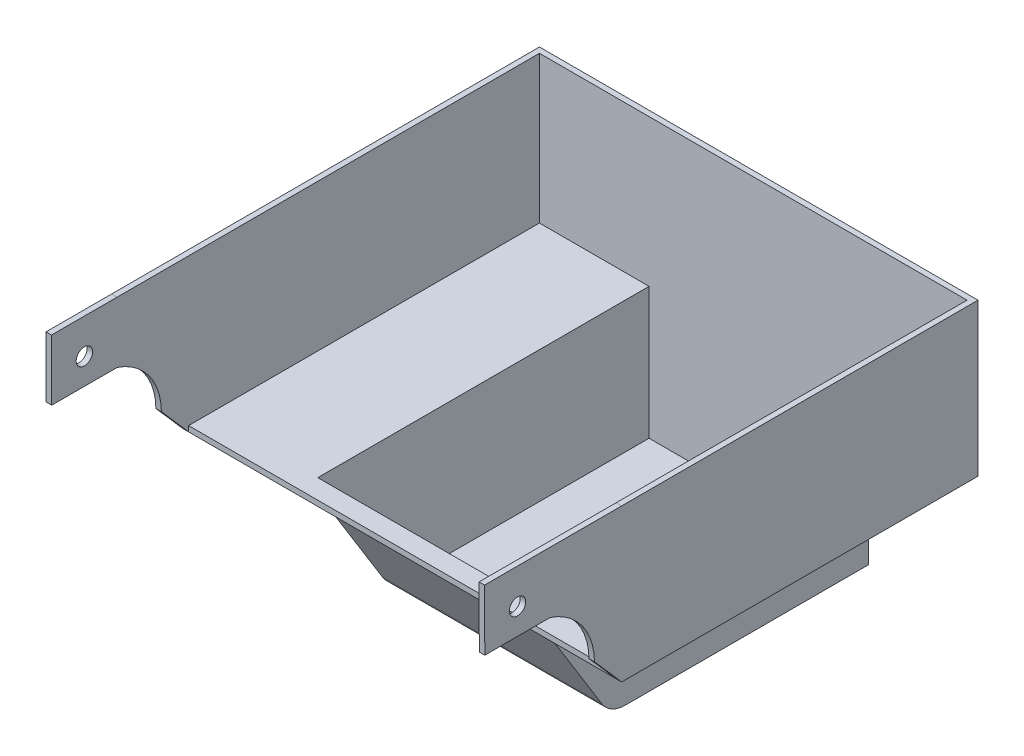
ISO-10303-21;
HEADER;
FILE_DESCRIPTION(('STEP AP214'),'2;1');
FILE_NAME('part.step','',(''),(''),'','','');
FILE_SCHEMA(('AUTOMOTIVE_DESIGN { 1 0 10303 214 1 1 1 1 }'));
ENDSEC;
DATA;
#1=APPLICATION_CONTEXT('core data for automotive mechanical design processes');
#2=APPLICATION_PROTOCOL_DEFINITION('international standard','automotive_design',2000,#1);
#3=PRODUCT_CONTEXT('',#1,'mechanical');
#4=PRODUCT('Part','Part','',(#3));
#5=PRODUCT_RELATED_PRODUCT_CATEGORY('part','',(#4));
#6=PRODUCT_DEFINITION_FORMATION('','',#4);
#7=PRODUCT_DEFINITION_CONTEXT('part definition',#1,'design');
#8=PRODUCT_DEFINITION('design','',#6,#7);
#9=PRODUCT_DEFINITION_SHAPE('','',#8);
#10=(LENGTH_UNIT() NAMED_UNIT(*) SI_UNIT(.MILLI.,.METRE.));
#11=(NAMED_UNIT(*) PLANE_ANGLE_UNIT() SI_UNIT($,.RADIAN.));
#12=(NAMED_UNIT(*) SI_UNIT($,.STERADIAN.) SOLID_ANGLE_UNIT());
#13=UNCERTAINTY_MEASURE_WITH_UNIT(LENGTH_MEASURE(1.E-05),#10,'distance_accuracy_value','');
#14=(GEOMETRIC_REPRESENTATION_CONTEXT(3) GLOBAL_UNCERTAINTY_ASSIGNED_CONTEXT((#13)) GLOBAL_UNIT_ASSIGNED_CONTEXT((#10,
#11,#12)) REPRESENTATION_CONTEXT('',''));
#15=CARTESIAN_POINT('',(0.,0.,0.));
#16=DIRECTION('',(0.,0.,1.));
#17=DIRECTION('',(1.,0.,0.));
#18=AXIS2_PLACEMENT_3D('',#15,#16,#17);
#19=CARTESIAN_POINT('',(0.,0.,130.));
#20=DIRECTION('',(0.,0.,-1.));
#21=DIRECTION('',(-1.,0.,0.));
#22=AXIS2_PLACEMENT_3D('',#19,#20,#21);
#23=PLANE('',#22);
#24=DIRECTION('',(0.,1.,0.));
#25=VECTOR('',#24,1.);
#26=CARTESIAN_POINT('',(78.,0.,130.));
#27=LINE('',#26,#25);
#28=CARTESIAN_POINT('',(78.,0.,130.));
#29=VERTEX_POINT('',#28);
#30=CARTESIAN_POINT('',(78.,2.,130.));
#31=VERTEX_POINT('',#30);
#32=EDGE_CURVE('E244',#29,#31,#27,.T.);
#33=ORIENTED_EDGE('',*,*,#32,.T.);
#34=DIRECTION('',(-1.,0.,0.));
#35=VECTOR('',#34,1.);
#36=CARTESIAN_POINT('',(0.,2.,130.));
#37=LINE('',#36,#35);
#38=CARTESIAN_POINT('',(-78.,2.,130.));
#39=VERTEX_POINT('',#38);
#40=EDGE_CURVE('E313',#31,#39,#37,.T.);
#41=ORIENTED_EDGE('',*,*,#40,.T.);
#42=DIRECTION('',(0.,-1.,0.));
#43=VECTOR('',#42,1.);
#44=CARTESIAN_POINT('',(-78.,0.,130.));
#45=LINE('',#44,#43);
#46=CARTESIAN_POINT('',(-78.,0.,130.));
#47=VERTEX_POINT('',#46);
#48=EDGE_CURVE('E44',#39,#47,#45,.T.);
#49=ORIENTED_EDGE('',*,*,#48,.T.);
#50=DIRECTION('',(1.,0.,0.));
#51=VECTOR('',#50,1.);
#52=CARTESIAN_POINT('',(-80.,0.,130.));
#53=LINE('',#52,#51);
#54=EDGE_CURVE('E388',#47,#29,#53,.T.);
#55=ORIENTED_EDGE('',*,*,#54,.T.);
#56=EDGE_LOOP('',(#33,#41,#49,#55));
#57=FACE_BOUND('',#56,.T.);
#58=ADVANCED_FACE('F35',(#57),#23,.F.);
#59=CARTESIAN_POINT('',(-80.,55.63,124.));
#60=DIRECTION('',(0.,-1.,0.));
#61=DIRECTION('',(0.,0.,-1.));
#62=AXIS2_PLACEMENT_3D('',#59,#60,#61);
#63=PLANE('',#62);
#64=DIRECTION('',(0.,0.,-1.));
#65=VECTOR('',#64,1.);
#66=CARTESIAN_POINT('',(-80.,55.63,124.));
#67=LINE('',#66,#65);
#68=CARTESIAN_POINT('',(-80.,55.63,156.092113107262));
#69=VERTEX_POINT('',#68);
#70=CARTESIAN_POINT('',(-80.,55.63,0.));
#71=VERTEX_POINT('',#70);
#72=EDGE_CURVE('E430',#69,#71,#67,.T.);
#73=ORIENTED_EDGE('',*,*,#72,.F.);
#74=DIRECTION('',(-1.,0.,0.));
#75=VECTOR('',#74,1.);
#76=CARTESIAN_POINT('',(-78.,55.63,156.092113107262));
#77=LINE('',#76,#75);
#78=CARTESIAN_POINT('',(-78.,55.63,156.092113107262));
#79=VERTEX_POINT('',#78);
#80=EDGE_CURVE('E308',#79,#69,#77,.T.);
#81=ORIENTED_EDGE('',*,*,#80,.F.);
#82=DIRECTION('',(0.,0.,-1.));
#83=VECTOR('',#82,1.);
#84=CARTESIAN_POINT('',(-78.,55.63,124.));
#85=LINE('',#84,#83);
#86=CARTESIAN_POINT('',(-78.,55.63,2.));
#87=VERTEX_POINT('',#86);
#88=EDGE_CURVE('E357',#79,#87,#85,.T.);
#89=ORIENTED_EDGE('',*,*,#88,.T.);
#90=DIRECTION('',(-1.,0.,0.));
#91=VECTOR('',#90,1.);
#92=CARTESIAN_POINT('',(0.,55.63,2.));
#93=LINE('',#92,#91);
#94=CARTESIAN_POINT('',(78.,55.63,2.));
#95=VERTEX_POINT('',#94);
#96=EDGE_CURVE('E361',#95,#87,#93,.T.);
#97=ORIENTED_EDGE('',*,*,#96,.F.);
#98=DIRECTION('',(0.,0.,-1.));
#99=VECTOR('',#98,1.);
#100=CARTESIAN_POINT('',(78.,55.63,124.));
#101=LINE('',#100,#99);
#102=CARTESIAN_POINT('',(78.,55.63,130.));
#103=VERTEX_POINT('',#102);
#104=EDGE_CURVE('E355',#103,#95,#101,.T.);
#105=ORIENTED_EDGE('',*,*,#104,.F.);
#106=DIRECTION('',(-1.,0.,0.));
#107=VECTOR('',#106,1.);
#108=CARTESIAN_POINT('',(-80.,55.63,130.));
#109=LINE('',#108,#107);
#110=CARTESIAN_POINT('',(80.,55.63,130.));
#111=VERTEX_POINT('',#110);
#112=EDGE_CURVE('E243',#111,#103,#109,.T.);
#113=ORIENTED_EDGE('',*,*,#112,.F.);
#114=DIRECTION('',(0.,0.,-1.));
#115=VECTOR('',#114,1.);
#116=CARTESIAN_POINT('',(80.,55.63,124.));
#117=LINE('',#116,#115);
#118=CARTESIAN_POINT('',(80.,55.63,0.));
#119=VERTEX_POINT('',#118);
#120=EDGE_CURVE('E433',#111,#119,#117,.T.);
#121=ORIENTED_EDGE('',*,*,#120,.T.);
#122=DIRECTION('',(-1.,0.,0.));
#123=VECTOR('',#122,1.);
#124=CARTESIAN_POINT('',(-80.,55.63,0.));
#125=LINE('',#124,#123);
#126=EDGE_CURVE('E403',#119,#71,#125,.T.);
#127=ORIENTED_EDGE('',*,*,#126,.T.);
#128=EDGE_LOOP('',(#73,#81,#89,#97,#105,#113,#121,#127));
#129=FACE_BOUND('',#128,.T.);
#130=ADVANCED_FACE('F474',(#129),#63,.F.);
#131=CARTESIAN_POINT('',(-40.,-48.,124.));
#132=DIRECTION('',(0.,1.,0.));
#133=DIRECTION('',(-1.,0.,0.));
#134=AXIS2_PLACEMENT_3D('',#131,#132,#133);
#135=PLANE('',#134);
#136=DIRECTION('',(-1.,0.,0.));
#137=VECTOR('',#136,1.);
#138=CARTESIAN_POINT('',(80.,-48.,88.7507921419018));
#139=LINE('',#138,#137);
#140=CARTESIAN_POINT('',(40.,-48.,88.7507921419018));
#141=VERTEX_POINT('',#140);
#142=CARTESIAN_POINT('',(-40.,-48.,88.7507921419018));
#143=VERTEX_POINT('',#142);
#144=EDGE_CURVE('E377',#141,#143,#139,.T.);
#145=ORIENTED_EDGE('',*,*,#144,.T.);
#146=DIRECTION('',(0.,0.,-1.));
#147=VECTOR('',#146,1.);
#148=CARTESIAN_POINT('',(-40.,-48.,124.));
#149=LINE('',#148,#147);
#150=CARTESIAN_POINT('',(-40.,-48.,0.));
#151=VERTEX_POINT('',#150);
#152=EDGE_CURVE('E423',#143,#151,#149,.T.);
#153=ORIENTED_EDGE('',*,*,#152,.T.);
#154=DIRECTION('',(1.,0.,0.));
#155=VECTOR('',#154,1.);
#156=CARTESIAN_POINT('',(-40.,-48.,0.));
#157=LINE('',#156,#155);
#158=CARTESIAN_POINT('',(40.,-48.,0.));
#159=VERTEX_POINT('',#158);
#160=EDGE_CURVE('E413',#151,#159,#157,.T.);
#161=ORIENTED_EDGE('',*,*,#160,.T.);
#162=DIRECTION('',(0.,0.,-1.));
#163=VECTOR('',#162,1.);
#164=CARTESIAN_POINT('',(40.,-48.,124.));
#165=LINE('',#164,#163);
#166=EDGE_CURVE('E421',#141,#159,#165,.T.);
#167=ORIENTED_EDGE('',*,*,#166,.F.);
#168=EDGE_LOOP('',(#145,#153,#161,#167));
#169=FACE_BOUND('',#168,.T.);
#170=ADVANCED_FACE('F447',(#169),#135,.F.);
#171=CARTESIAN_POINT('',(80.,55.63,124.));
#172=DIRECTION('',(-1.,0.,0.));
#173=DIRECTION('',(0.,0.,1.));
#174=AXIS2_PLACEMENT_3D('',#171,#172,#173);
#175=PLANE('',#174);
#176=CARTESIAN_POINT('',(80.,42.8788561148023,168.015437142677));
#177=DIRECTION('',(1.,0.,0.));
#178=DIRECTION('',(0.,0.,-1.));
#179=AXIS2_PLACEMENT_3D('',#176,#177,#178);
#180=CIRCLE('',#179,2.99999999999999);
#181=CARTESIAN_POINT('',(80.,42.8788561148023,165.015437142677));
#182=VERTEX_POINT('',#181);
#183=EDGE_CURVE('E620',#182,#182,#180,.T.);
#184=ORIENTED_EDGE('',*,*,#183,.F.);
#185=EDGE_LOOP('',(#184));
#186=FACE_BOUND('',#185,.T.);
#187=DIRECTION('',(0.,1.,0.));
#188=VECTOR('',#187,1.);
#189=CARTESIAN_POINT('',(80.,55.63,0.));
#190=LINE('',#189,#188);
#191=CARTESIAN_POINT('',(80.,0.,0.));
#192=VERTEX_POINT('',#191);
#193=EDGE_CURVE('E401',#192,#119,#190,.T.);
#194=ORIENTED_EDGE('',*,*,#193,.T.);
#195=ORIENTED_EDGE('',*,*,#120,.F.);
#196=DIRECTION('',(0.,-5.22082282492771E-06,0.999999999986371));
#197=VECTOR('',#196,1.);
#198=CARTESIAN_POINT('',(80.,55.63,130.));
#199=LINE('',#198,#197);
#200=CARTESIAN_POINT('',(80.,55.6297388202511,180.026549010974));
#201=VERTEX_POINT('',#200);
#202=EDGE_CURVE('E257',#111,#201,#199,.T.);
#203=ORIENTED_EDGE('',*,*,#202,.T.);
#204=DIRECTION('',(0.,-0.99999219743184,-0.00395032599163589));
#205=VECTOR('',#204,1.);
#206=CARTESIAN_POINT('',(80.,55.6297388202511,180.026549010974));
#207=LINE('',#206,#205);
#208=CARTESIAN_POINT('',(80.,33.4069784459925,179.938761178091));
#209=VERTEX_POINT('',#208);
#210=EDGE_CURVE('E221',#201,#209,#207,.T.);
#211=ORIENTED_EDGE('',*,*,#210,.T.);
#212=DIRECTION('',(0.,0.,-1.));
#213=VECTOR('',#212,1.);
#214=CARTESIAN_POINT('',(80.,33.4069784459925,179.938761178091));
#215=LINE('',#214,#213);
#216=CARTESIAN_POINT('',(80.,33.4069784459925,156.092113107262));
#217=VERTEX_POINT('',#216);
#218=EDGE_CURVE('E261',#209,#217,#215,.T.);
#219=ORIENTED_EDGE('',*,*,#218,.T.);
#220=CARTESIAN_POINT('',(80.,11.1500000505858,163.334420687461));
#221=DIRECTION('',(-1.,0.,0.));
#222=DIRECTION('',(0.,0.,-1.));
#223=AXIS2_PLACEMENT_3D('',#220,#221,#222);
#224=CIRCLE('',#223,23.4056426183901);
#225=CARTESIAN_POINT('',(80.,11.3483376382493,139.929618432772));
#226=VERTEX_POINT('',#225);
#227=EDGE_CURVE('E264',#217,#226,#224,.T.);
#228=ORIENTED_EDGE('',*,*,#227,.T.);
#229=DIRECTION('',(0.,-0.752582511776215,-0.658497959730023));
#230=VECTOR('',#229,1.);
#231=CARTESIAN_POINT('',(80.,11.3483376382493,139.929618432772));
#232=LINE('',#231,#230);
#233=CARTESIAN_POINT('',(80.,0.,130.));
#234=VERTEX_POINT('',#233);
#235=EDGE_CURVE('E247',#226,#234,#232,.T.);
#236=ORIENTED_EDGE('',*,*,#235,.T.);
#237=DIRECTION('',(0.,0.,-1.));
#238=VECTOR('',#237,1.);
#239=CARTESIAN_POINT('',(80.,0.,124.));
#240=LINE('',#239,#238);
#241=EDGE_CURVE('E398',#234,#192,#240,.T.);
#242=ORIENTED_EDGE('',*,*,#241,.T.);
#243=EDGE_LOOP('',(#194,#195,#203,#211,#219,#228,#236,#242));
#244=FACE_BOUND('',#243,.T.);
#245=ADVANCED_FACE('F37',(#186,#244),#175,.F.);
#246=CARTESIAN_POINT('',(-80.,0.,124.));
#247=DIRECTION('',(1.,0.,0.));
#248=DIRECTION('',(0.,0.,-1.));
#249=AXIS2_PLACEMENT_3D('',#246,#247,#248);
#250=PLANE('',#249);
#251=CARTESIAN_POINT('',(-80.,42.8788561148023,168.015437142677));
#252=DIRECTION('',(1.,0.,0.));
#253=DIRECTION('',(0.,0.,-1.));
#254=AXIS2_PLACEMENT_3D('',#251,#252,#253);
#255=CIRCLE('',#254,2.99999999999999);
#256=CARTESIAN_POINT('',(-80.,42.8788561148023,165.015437142677));
#257=VERTEX_POINT('',#256);
#258=EDGE_CURVE('E503',#257,#257,#255,.T.);
#259=ORIENTED_EDGE('',*,*,#258,.T.);
#260=EDGE_LOOP('',(#259));
#261=FACE_BOUND('',#260,.T.);
#262=DIRECTION('',(0.,0.752582511776214,0.658497959730025));
#263=VECTOR('',#262,1.);
#264=CARTESIAN_POINT('',(-80.,29.82008938625,156.092113107262));
#265=LINE('',#264,#263);
#266=CARTESIAN_POINT('',(-80.,0.,130.));
#267=VERTEX_POINT('',#266);
#268=CARTESIAN_POINT('',(-80.,11.3483376382493,139.929618432772));
#269=VERTEX_POINT('',#268);
#270=EDGE_CURVE('E301',#267,#269,#265,.T.);
#271=ORIENTED_EDGE('',*,*,#270,.T.);
#272=CARTESIAN_POINT('',(-80.,11.1500000505858,163.334420687461));
#273=DIRECTION('',(-1.,0.,0.));
#274=DIRECTION('',(0.,0.,1.));
#275=AXIS2_PLACEMENT_3D('',#272,#273,#274);
#276=CIRCLE('',#275,23.4056426183901);
#277=CARTESIAN_POINT('',(-80.,33.4069784459925,156.092113107262));
#278=VERTEX_POINT('',#277);
#279=EDGE_CURVE('E58',#278,#269,#276,.T.);
#280=ORIENTED_EDGE('',*,*,#279,.F.);
#281=DIRECTION('',(0.,0.,1.));
#282=VECTOR('',#281,1.);
#283=CARTESIAN_POINT('',(-80.,33.4069784459925,156.092113107262));
#284=LINE('',#283,#282);
#285=CARTESIAN_POINT('',(-80.,33.4069784459925,179.938761178091));
#286=VERTEX_POINT('',#285);
#287=EDGE_CURVE('E270',#278,#286,#284,.T.);
#288=ORIENTED_EDGE('',*,*,#287,.T.);
#289=DIRECTION('',(0.,0.99999219743184,0.00395032599163589));
#290=VECTOR('',#289,1.);
#291=CARTESIAN_POINT('',(-80.,33.4069784459925,179.938761178091));
#292=LINE('',#291,#290);
#293=CARTESIAN_POINT('',(-80.,55.6297388202511,180.026549010974));
#294=VERTEX_POINT('',#293);
#295=EDGE_CURVE('E288',#286,#294,#292,.T.);
#296=ORIENTED_EDGE('',*,*,#295,.T.);
#297=DIRECTION('',(0.,1.09123001673236E-05,-0.999999999940461));
#298=VECTOR('',#297,1.);
#299=CARTESIAN_POINT('',(-80.,55.6297388202511,180.026549010974));
#300=LINE('',#299,#298);
#301=EDGE_CURVE('E280',#294,#69,#300,.T.);
#302=ORIENTED_EDGE('',*,*,#301,.T.);
#303=ORIENTED_EDGE('',*,*,#72,.T.);
#304=DIRECTION('',(0.,-1.,0.));
#305=VECTOR('',#304,1.);
#306=CARTESIAN_POINT('',(-80.,0.,0.));
#307=LINE('',#306,#305);
#308=CARTESIAN_POINT('',(-80.,0.,0.));
#309=VERTEX_POINT('',#308);
#310=EDGE_CURVE('E405',#71,#309,#307,.T.);
#311=ORIENTED_EDGE('',*,*,#310,.T.);
#312=DIRECTION('',(0.,0.,-1.));
#313=VECTOR('',#312,1.);
#314=CARTESIAN_POINT('',(-80.,0.,124.));
#315=LINE('',#314,#313);
#316=EDGE_CURVE('E428',#267,#309,#315,.T.);
#317=ORIENTED_EDGE('',*,*,#316,.F.);
#318=EDGE_LOOP('',(#271,#280,#288,#296,#302,#303,#311,#317));
#319=FACE_BOUND('',#318,.T.);
#320=ADVANCED_FACE('F492',(#261,#319),#250,.F.);
#321=CARTESIAN_POINT('',(-80.,0.,124.));
#322=DIRECTION('',(0.,1.,0.));
#323=DIRECTION('',(0.,0.,1.));
#324=AXIS2_PLACEMENT_3D('',#321,#322,#323);
#325=PLANE('',#324);
#326=DIRECTION('',(0.,0.,-1.));
#327=VECTOR('',#326,1.);
#328=CARTESIAN_POINT('',(-40.,0.,124.));
#329=LINE('',#328,#327);
#330=CARTESIAN_POINT('',(-40.,0.,124.));
#331=VERTEX_POINT('',#330);
#332=CARTESIAN_POINT('',(-40.,0.,0.));
#333=VERTEX_POINT('',#332);
#334=EDGE_CURVE('E425',#331,#333,#329,.T.);
#335=ORIENTED_EDGE('',*,*,#334,.F.);
#336=DIRECTION('',(1.,0.,0.));
#337=VECTOR('',#336,1.);
#338=CARTESIAN_POINT('',(-80.,0.,124.));
#339=LINE('',#338,#337);
#340=CARTESIAN_POINT('',(40.,0.,124.));
#341=VERTEX_POINT('',#340);
#342=EDGE_CURVE('E394',#331,#341,#339,.T.);
#343=ORIENTED_EDGE('',*,*,#342,.T.);
#344=DIRECTION('',(0.,0.,-1.));
#345=VECTOR('',#344,1.);
#346=CARTESIAN_POINT('',(40.,0.,124.));
#347=LINE('',#346,#345);
#348=CARTESIAN_POINT('',(40.,0.,0.));
#349=VERTEX_POINT('',#348);
#350=EDGE_CURVE('E418',#341,#349,#347,.T.);
#351=ORIENTED_EDGE('',*,*,#350,.T.);
#352=DIRECTION('',(1.,0.,0.));
#353=VECTOR('',#352,1.);
#354=CARTESIAN_POINT('',(40.,0.,0.));
#355=LINE('',#354,#353);
#356=EDGE_CURVE('E393',#349,#192,#355,.T.);
#357=ORIENTED_EDGE('',*,*,#356,.T.);
#358=ORIENTED_EDGE('',*,*,#241,.F.);
#359=DIRECTION('',(1.,0.,0.));
#360=VECTOR('',#359,1.);
#361=CARTESIAN_POINT('',(78.,0.,130.));
#362=LINE('',#361,#360);
#363=EDGE_CURVE('E51',#29,#234,#362,.T.);
#364=ORIENTED_EDGE('',*,*,#363,.F.);
#365=ORIENTED_EDGE('',*,*,#54,.F.);
#366=EDGE_CURVE('E389',#267,#47,#53,.T.);
#367=ORIENTED_EDGE('',*,*,#366,.F.);
#368=ORIENTED_EDGE('',*,*,#316,.T.);
#369=DIRECTION('',(1.,0.,0.));
#370=VECTOR('',#369,1.);
#371=CARTESIAN_POINT('',(-80.,0.,0.));
#372=LINE('',#371,#370);
#373=EDGE_CURVE('E408',#309,#333,#372,.T.);
#374=ORIENTED_EDGE('',*,*,#373,.T.);
#375=EDGE_LOOP('',(#335,#343,#351,#357,#358,#364,#365,#367,#368,#374));
#376=FACE_BOUND('',#375,.T.);
#377=ADVANCED_FACE('F457',(#376),#325,.F.);
#378=CARTESIAN_POINT('',(-40.,-48.,124.));
#379=DIRECTION('',(1.,0.,0.));
#380=DIRECTION('',(0.,0.,-1.));
#381=AXIS2_PLACEMENT_3D('',#378,#379,#380);
#382=PLANE('',#381);
#383=ORIENTED_EDGE('',*,*,#152,.F.);
#384=CARTESIAN_POINT('',(-40.,-38.,88.7507921419018));
#385=DIRECTION('',(1.,0.,0.));
#386=DIRECTION('',(0.,0.,-1.));
#387=AXIS2_PLACEMENT_3D('',#384,#385,#386);
#388=CIRCLE('',#387,10.);
#389=CARTESIAN_POINT('',(-40.,-43.2584793879041,97.25657808601));
#390=VERTEX_POINT('',#389);
#391=EDGE_CURVE('E385',#143,#390,#388,.F.);
#392=ORIENTED_EDGE('',*,*,#391,.T.);
#393=DIRECTION('',(0.,0.850578594410813,0.525847938790413));
#394=VECTOR('',#393,1.);
#395=CARTESIAN_POINT('',(-40.,-34.727229372954,102.530799968792));
#396=LINE('',#395,#394);
#397=EDGE_CURVE('E380',#390,#331,#396,.T.);
#398=ORIENTED_EDGE('',*,*,#397,.T.);
#399=ORIENTED_EDGE('',*,*,#334,.T.);
#400=DIRECTION('',(0.,-1.,0.));
#401=VECTOR('',#400,1.);
#402=CARTESIAN_POINT('',(-40.,-48.,0.));
#403=LINE('',#402,#401);
#404=EDGE_CURVE('E410',#333,#151,#403,.T.);
#405=ORIENTED_EDGE('',*,*,#404,.T.);
#406=EDGE_LOOP('',(#383,#392,#398,#399,#405));
#407=FACE_BOUND('',#406,.T.);
#408=ADVANCED_FACE('F461',(#407),#382,.F.);
#409=CARTESIAN_POINT('',(40.,0.,124.));
#410=DIRECTION('',(-1.,0.,0.));
#411=DIRECTION('',(0.,-1.,0.));
#412=AXIS2_PLACEMENT_3D('',#409,#410,#411);
#413=PLANE('',#412);
#414=DIRECTION('',(0.,-0.850578594410813,-0.525847938790413));
#415=VECTOR('',#414,1.);
#416=CARTESIAN_POINT('',(40.,0.,124.));
#417=LINE('',#416,#415);
#418=CARTESIAN_POINT('',(40.,-43.2584793879041,97.25657808601));
#419=VERTEX_POINT('',#418);
#420=EDGE_CURVE('E397',#341,#419,#417,.T.);
#421=ORIENTED_EDGE('',*,*,#420,.T.);
#422=CARTESIAN_POINT('',(40.,-38.,88.7507921419018));
#423=DIRECTION('',(-1.,0.,0.));
#424=DIRECTION('',(0.,-1.,0.));
#425=AXIS2_PLACEMENT_3D('',#422,#423,#424);
#426=CIRCLE('',#425,10.);
#427=EDGE_CURVE('E304',#419,#141,#426,.F.);
#428=ORIENTED_EDGE('',*,*,#427,.T.);
#429=ORIENTED_EDGE('',*,*,#166,.T.);
#430=DIRECTION('',(0.,1.,0.));
#431=VECTOR('',#430,1.);
#432=CARTESIAN_POINT('',(40.,0.,0.));
#433=LINE('',#432,#431);
#434=EDGE_CURVE('E416',#159,#349,#433,.T.);
#435=ORIENTED_EDGE('',*,*,#434,.T.);
#436=ORIENTED_EDGE('',*,*,#350,.F.);
#437=EDGE_LOOP('',(#421,#428,#429,#435,#436));
#438=FACE_BOUND('',#437,.T.);
#439=ADVANCED_FACE('F443',(#438),#413,.F.);
#440=CARTESIAN_POINT('',(0.,0.,0.));
#441=DIRECTION('',(0.,0.,-1.));
#442=DIRECTION('',(-1.,0.,0.));
#443=AXIS2_PLACEMENT_3D('',#440,#441,#442);
#444=PLANE('',#443);
#445=ORIENTED_EDGE('',*,*,#356,.F.);
#446=ORIENTED_EDGE('',*,*,#434,.F.);
#447=ORIENTED_EDGE('',*,*,#160,.F.);
#448=ORIENTED_EDGE('',*,*,#404,.F.);
#449=ORIENTED_EDGE('',*,*,#373,.F.);
#450=ORIENTED_EDGE('',*,*,#310,.F.);
#451=ORIENTED_EDGE('',*,*,#126,.F.);
#452=ORIENTED_EDGE('',*,*,#193,.F.);
#453=EDGE_LOOP('',(#445,#446,#447,#448,#449,#450,#451,#452));
#454=FACE_BOUND('',#453,.T.);
#455=ADVANCED_FACE('F454',(#454),#444,.T.);
#456=CARTESIAN_POINT('',(80.,-38.,88.7507921419018));
#457=DIRECTION('',(-1.,0.,0.));
#458=DIRECTION('',(0.,0.,1.));
#459=AXIS2_PLACEMENT_3D('',#456,#457,#458);
#460=CYLINDRICAL_SURFACE('',#459,10.);
#461=ORIENTED_EDGE('',*,*,#144,.F.);
#462=ORIENTED_EDGE('',*,*,#427,.F.);
#463=DIRECTION('',(-1.,0.,0.));
#464=VECTOR('',#463,1.);
#465=CARTESIAN_POINT('',(80.,-43.2584793879041,97.25657808601));
#466=LINE('',#465,#464);
#467=EDGE_CURVE('E370',#419,#390,#466,.T.);
#468=ORIENTED_EDGE('',*,*,#467,.T.);
#469=ORIENTED_EDGE('',*,*,#391,.F.);
#470=EDGE_LOOP('',(#461,#462,#468,#469));
#471=FACE_BOUND('',#470,.T.);
#472=ADVANCED_FACE('F462',(#471),#460,.T.);
#473=CARTESIAN_POINT('',(80.,0.,124.));
#474=DIRECTION('',(0.,0.525847938790413,-0.850578594410813));
#475=DIRECTION('',(0.,0.850578594410813,0.525847938790413));
#476=AXIS2_PLACEMENT_3D('',#473,#474,#475);
#477=PLANE('',#476);
#478=ORIENTED_EDGE('',*,*,#467,.F.);
#479=ORIENTED_EDGE('',*,*,#420,.F.);
#480=ORIENTED_EDGE('',*,*,#342,.F.);
#481=ORIENTED_EDGE('',*,*,#397,.F.);
#482=EDGE_LOOP('',(#478,#479,#480,#481));
#483=FACE_BOUND('',#482,.T.);
#484=ADVANCED_FACE('F459',(#483),#477,.F.);
#485=CARTESIAN_POINT('',(-40.,-46.,124.));
#486=DIRECTION('',(0.,1.,0.));
#487=DIRECTION('',(-1.,0.,0.));
#488=AXIS2_PLACEMENT_3D('',#485,#486,#487);
#489=PLANE('',#488);
#490=DIRECTION('',(-1.,0.,0.));
#491=VECTOR('',#490,1.);
#492=CARTESIAN_POINT('',(-40.,-46.,88.7507921419018));
#493=LINE('',#492,#491);
#494=CARTESIAN_POINT('',(38.,-46.,88.7507921419018));
#495=VERTEX_POINT('',#494);
#496=CARTESIAN_POINT('',(-38.,-46.,88.7507921419018));
#497=VERTEX_POINT('',#496);
#498=EDGE_CURVE('E317',#495,#497,#493,.T.);
#499=ORIENTED_EDGE('',*,*,#498,.F.);
#500=DIRECTION('',(0.,0.,-1.));
#501=VECTOR('',#500,1.);
#502=CARTESIAN_POINT('',(38.,-46.,124.));
#503=LINE('',#502,#501);
#504=CARTESIAN_POINT('',(38.,-46.,2.));
#505=VERTEX_POINT('',#504);
#506=EDGE_CURVE('E324',#495,#505,#503,.T.);
#507=ORIENTED_EDGE('',*,*,#506,.T.);
#508=DIRECTION('',(1.,0.,0.));
#509=VECTOR('',#508,1.);
#510=CARTESIAN_POINT('',(0.,-46.,2.));
#511=LINE('',#510,#509);
#512=CARTESIAN_POINT('',(-38.,-46.,2.));
#513=VERTEX_POINT('',#512);
#514=EDGE_CURVE('E325',#513,#505,#511,.T.);
#515=ORIENTED_EDGE('',*,*,#514,.F.);
#516=DIRECTION('',(0.,0.,-1.));
#517=VECTOR('',#516,1.);
#518=CARTESIAN_POINT('',(-38.,-46.,124.));
#519=LINE('',#518,#517);
#520=EDGE_CURVE('E321',#497,#513,#519,.T.);
#521=ORIENTED_EDGE('',*,*,#520,.F.);
#522=EDGE_LOOP('',(#499,#507,#515,#521));
#523=FACE_BOUND('',#522,.T.);
#524=ADVANCED_FACE('F469',(#523),#489,.T.);
#525=CARTESIAN_POINT('',(78.,55.63,124.));
#526=DIRECTION('',(-1.,0.,0.));
#527=DIRECTION('',(0.,0.,1.));
#528=AXIS2_PLACEMENT_3D('',#525,#526,#527);
#529=PLANE('',#528);
#530=CARTESIAN_POINT('',(78.,42.8788561148023,168.015437142677));
#531=DIRECTION('',(-1.,0.,0.));
#532=DIRECTION('',(0.,0.,1.));
#533=AXIS2_PLACEMENT_3D('',#530,#531,#532);
#534=CIRCLE('',#533,2.99999999999999);
#535=CARTESIAN_POINT('',(78.,42.8788561148023,171.015437142677));
#536=VERTEX_POINT('',#535);
#537=EDGE_CURVE('E259',#536,#536,#534,.T.);
#538=ORIENTED_EDGE('',*,*,#537,.F.);
#539=EDGE_LOOP('',(#538));
#540=FACE_BOUND('',#539,.T.);
#541=DIRECTION('',(0.,1.,0.));
#542=VECTOR('',#541,1.);
#543=CARTESIAN_POINT('',(78.,0.,2.));
#544=LINE('',#543,#542);
#545=CARTESIAN_POINT('',(78.,2.,2.));
#546=VERTEX_POINT('',#545);
#547=EDGE_CURVE('E353',#546,#95,#544,.T.);
#548=ORIENTED_EDGE('',*,*,#547,.F.);
#549=DIRECTION('',(0.,0.,-1.));
#550=VECTOR('',#549,1.);
#551=CARTESIAN_POINT('',(78.,2.,124.));
#552=LINE('',#551,#550);
#553=EDGE_CURVE('E348',#31,#546,#552,.T.);
#554=ORIENTED_EDGE('',*,*,#553,.F.);
#555=ORIENTED_EDGE('',*,*,#32,.F.);
#556=DIRECTION('',(0.,-0.752582511776215,-0.658497959730023));
#557=VECTOR('',#556,1.);
#558=CARTESIAN_POINT('',(78.,11.3483376382493,139.929618432772));
#559=LINE('',#558,#557);
#560=CARTESIAN_POINT('',(78.,11.3483376382493,139.929618432772));
#561=VERTEX_POINT('',#560);
#562=EDGE_CURVE('E227',#561,#29,#559,.T.);
#563=ORIENTED_EDGE('',*,*,#562,.F.);
#564=CARTESIAN_POINT('',(78.,11.1500000505858,163.334420687461));
#565=DIRECTION('',(-1.,0.,0.));
#566=DIRECTION('',(0.,0.,-1.));
#567=AXIS2_PLACEMENT_3D('',#564,#565,#566);
#568=CIRCLE('',#567,23.4056426183901);
#569=CARTESIAN_POINT('',(78.,33.4069784459925,156.092113107262));
#570=VERTEX_POINT('',#569);
#571=EDGE_CURVE('E252',#570,#561,#568,.T.);
#572=ORIENTED_EDGE('',*,*,#571,.F.);
#573=DIRECTION('',(0.,0.,-1.));
#574=VECTOR('',#573,1.);
#575=CARTESIAN_POINT('',(78.,33.4069784459925,179.938761178091));
#576=LINE('',#575,#574);
#577=CARTESIAN_POINT('',(78.,33.4069784459925,179.938761178091));
#578=VERTEX_POINT('',#577);
#579=EDGE_CURVE('E238',#578,#570,#576,.T.);
#580=ORIENTED_EDGE('',*,*,#579,.F.);
#581=DIRECTION('',(0.,-0.99999219743184,-0.00395032599163589));
#582=VECTOR('',#581,1.);
#583=CARTESIAN_POINT('',(78.,55.6297388202511,180.026549010974));
#584=LINE('',#583,#582);
#585=CARTESIAN_POINT('',(78.,55.6297388202511,180.026549010974));
#586=VERTEX_POINT('',#585);
#587=EDGE_CURVE('E219',#586,#578,#584,.T.);
#588=ORIENTED_EDGE('',*,*,#587,.F.);
#589=DIRECTION('',(0.,-5.22082282492771E-06,0.999999999986371));
#590=VECTOR('',#589,1.);
#591=CARTESIAN_POINT('',(78.,55.63,130.));
#592=LINE('',#591,#590);
#593=EDGE_CURVE('E235',#103,#586,#592,.T.);
#594=ORIENTED_EDGE('',*,*,#593,.F.);
#595=ORIENTED_EDGE('',*,*,#104,.T.);
#596=EDGE_LOOP('',(#548,#554,#555,#563,#572,#580,#588,#594,#595));
#597=FACE_BOUND('',#596,.T.);
#598=ADVANCED_FACE('F233',(#540,#597),#529,.T.);
#599=CARTESIAN_POINT('',(-78.,0.,124.));
#600=DIRECTION('',(1.,0.,0.));
#601=DIRECTION('',(0.,0.,-1.));
#602=AXIS2_PLACEMENT_3D('',#599,#600,#601);
#603=PLANE('',#602);
#604=CARTESIAN_POINT('',(-78.,42.8788561148023,168.015437142677));
#605=DIRECTION('',(1.,0.,0.));
#606=DIRECTION('',(0.,0.,-1.));
#607=AXIS2_PLACEMENT_3D('',#604,#605,#606);
#608=CIRCLE('',#607,2.99999999999999);
#609=CARTESIAN_POINT('',(-78.,42.8788561148023,165.015437142677));
#610=VERTEX_POINT('',#609);
#611=EDGE_CURVE('E39',#610,#610,#608,.T.);
#612=ORIENTED_EDGE('',*,*,#611,.F.);
#613=EDGE_LOOP('',(#612));
#614=FACE_BOUND('',#613,.T.);
#615=CARTESIAN_POINT('',(-78.,11.1500000505858,163.334420687461));
#616=DIRECTION('',(1.,0.,0.));
#617=DIRECTION('',(0.,0.,-1.));
#618=AXIS2_PLACEMENT_3D('',#615,#616,#617);
#619=CIRCLE('',#618,23.4056426183901);
#620=CARTESIAN_POINT('',(-78.,11.3483376382493,139.929618432772));
#621=VERTEX_POINT('',#620);
#622=CARTESIAN_POINT('',(-78.,33.4069784459925,156.092113107262));
#623=VERTEX_POINT('',#622);
#624=EDGE_CURVE('E296',#621,#623,#619,.T.);
#625=ORIENTED_EDGE('',*,*,#624,.F.);
#626=DIRECTION('',(0.,0.752582511776214,0.658497959730025));
#627=VECTOR('',#626,1.);
#628=CARTESIAN_POINT('',(-78.,29.82008938625,156.092113107262));
#629=LINE('',#628,#627);
#630=EDGE_CURVE('E305',#47,#621,#629,.T.);
#631=ORIENTED_EDGE('',*,*,#630,.F.);
#632=ORIENTED_EDGE('',*,*,#48,.F.);
#633=DIRECTION('',(0.,0.,-1.));
#634=VECTOR('',#633,1.);
#635=CARTESIAN_POINT('',(-78.,2.,124.));
#636=LINE('',#635,#634);
#637=CARTESIAN_POINT('',(-78.,2.,2.));
#638=VERTEX_POINT('',#637);
#639=EDGE_CURVE('E340',#39,#638,#636,.T.);
#640=ORIENTED_EDGE('',*,*,#639,.T.);
#641=DIRECTION('',(0.,-1.,0.));
#642=VECTOR('',#641,1.);
#643=CARTESIAN_POINT('',(-78.,0.,2.));
#644=LINE('',#643,#642);
#645=EDGE_CURVE('E359',#87,#638,#644,.T.);
#646=ORIENTED_EDGE('',*,*,#645,.F.);
#647=ORIENTED_EDGE('',*,*,#88,.F.);
#648=DIRECTION('',(0.,1.09123001673236E-05,-0.999999999940461));
#649=VECTOR('',#648,1.);
#650=CARTESIAN_POINT('',(-78.,55.6297388202511,180.026549010974));
#651=LINE('',#650,#649);
#652=CARTESIAN_POINT('',(-78.,55.6297388202511,180.026549010974));
#653=VERTEX_POINT('',#652);
#654=EDGE_CURVE('E283',#653,#79,#651,.T.);
#655=ORIENTED_EDGE('',*,*,#654,.F.);
#656=DIRECTION('',(0.,0.99999219743184,0.00395032599163589));
#657=VECTOR('',#656,1.);
#658=CARTESIAN_POINT('',(-78.,33.4069784459925,179.938761178091));
#659=LINE('',#658,#657);
#660=CARTESIAN_POINT('',(-78.,33.4069784459925,179.938761178091));
#661=VERTEX_POINT('',#660);
#662=EDGE_CURVE('E279',#661,#653,#659,.T.);
#663=ORIENTED_EDGE('',*,*,#662,.F.);
#664=DIRECTION('',(0.,0.,1.));
#665=VECTOR('',#664,1.);
#666=CARTESIAN_POINT('',(-78.,33.4069784459925,156.092113107262));
#667=LINE('',#666,#665);
#668=EDGE_CURVE('E276',#623,#661,#667,.T.);
#669=ORIENTED_EDGE('',*,*,#668,.F.);
#670=EDGE_LOOP('',(#625,#631,#632,#640,#646,#647,#655,#663,#669));
#671=FACE_BOUND('',#670,.T.);
#672=ADVANCED_FACE('F512',(#614,#671),#603,.T.);
#673=CARTESIAN_POINT('',(-80.,2.,124.));
#674=DIRECTION('',(0.,1.,0.));
#675=DIRECTION('',(0.,0.,1.));
#676=AXIS2_PLACEMENT_3D('',#673,#674,#675);
#677=PLANE('',#676);
#678=DIRECTION('',(0.,0.,-1.));
#679=VECTOR('',#678,1.);
#680=CARTESIAN_POINT('',(-38.,2.,124.));
#681=LINE('',#680,#679);
#682=CARTESIAN_POINT('',(-38.,2.,122.885106998165));
#683=VERTEX_POINT('',#682);
#684=CARTESIAN_POINT('',(-38.,2.,2.));
#685=VERTEX_POINT('',#684);
#686=EDGE_CURVE('E323',#683,#685,#681,.T.);
#687=ORIENTED_EDGE('',*,*,#686,.T.);
#688=DIRECTION('',(1.,0.,0.));
#689=VECTOR('',#688,1.);
#690=CARTESIAN_POINT('',(0.,2.,2.));
#691=LINE('',#690,#689);
#692=EDGE_CURVE('E343',#638,#685,#691,.T.);
#693=ORIENTED_EDGE('',*,*,#692,.F.);
#694=ORIENTED_EDGE('',*,*,#639,.F.);
#695=ORIENTED_EDGE('',*,*,#40,.F.);
#696=ORIENTED_EDGE('',*,*,#553,.T.);
#697=DIRECTION('',(1.,0.,0.));
#698=VECTOR('',#697,1.);
#699=CARTESIAN_POINT('',(0.,2.,2.));
#700=LINE('',#699,#698);
#701=CARTESIAN_POINT('',(38.,2.,2.));
#702=VERTEX_POINT('',#701);
#703=EDGE_CURVE('E335',#702,#546,#700,.T.);
#704=ORIENTED_EDGE('',*,*,#703,.F.);
#705=DIRECTION('',(0.,0.,-1.));
#706=VECTOR('',#705,1.);
#707=CARTESIAN_POINT('',(38.,2.,124.));
#708=LINE('',#707,#706);
#709=CARTESIAN_POINT('',(38.,2.,122.885106998165));
#710=VERTEX_POINT('',#709);
#711=EDGE_CURVE('E331',#710,#702,#708,.T.);
#712=ORIENTED_EDGE('',*,*,#711,.F.);
#713=DIRECTION('',(1.,0.,0.));
#714=VECTOR('',#713,1.);
#715=CARTESIAN_POINT('',(80.,2.,122.885106998165));
#716=LINE('',#715,#714);
#717=EDGE_CURVE('E344',#683,#710,#716,.T.);
#718=ORIENTED_EDGE('',*,*,#717,.F.);
#719=EDGE_LOOP('',(#687,#693,#694,#695,#696,#704,#712,#718));
#720=FACE_BOUND('',#719,.T.);
#721=ADVANCED_FACE('F548',(#720),#677,.T.);
#722=CARTESIAN_POINT('',(-38.,-48.,124.));
#723=DIRECTION('',(1.,0.,0.));
#724=DIRECTION('',(0.,0.,-1.));
#725=AXIS2_PLACEMENT_3D('',#722,#723,#724);
#726=PLANE('',#725);
#727=ORIENTED_EDGE('',*,*,#520,.T.);
#728=DIRECTION('',(0.,-1.,0.));
#729=VECTOR('',#728,1.);
#730=CARTESIAN_POINT('',(-38.,0.,2.));
#731=LINE('',#730,#729);
#732=EDGE_CURVE('E329',#685,#513,#731,.T.);
#733=ORIENTED_EDGE('',*,*,#732,.F.);
#734=ORIENTED_EDGE('',*,*,#686,.F.);
#735=DIRECTION('',(0.,0.850578594410813,0.525847938790413));
#736=VECTOR('',#735,1.);
#737=CARTESIAN_POINT('',(-38.,-33.6755334953732,100.82964277997));
#738=LINE('',#737,#736);
#739=CARTESIAN_POINT('',(-38.,-42.2067835103233,95.5554208971884));
#740=VERTEX_POINT('',#739);
#741=EDGE_CURVE('E320',#740,#683,#738,.T.);
#742=ORIENTED_EDGE('',*,*,#741,.F.);
#743=CARTESIAN_POINT('',(-38.,-38.,88.7507921419018));
#744=DIRECTION('',(1.,0.,0.));
#745=DIRECTION('',(0.,0.,-1.));
#746=AXIS2_PLACEMENT_3D('',#743,#744,#745);
#747=CIRCLE('',#746,8.00000000000001);
#748=EDGE_CURVE('E332',#497,#740,#747,.F.);
#749=ORIENTED_EDGE('',*,*,#748,.F.);
#750=EDGE_LOOP('',(#727,#733,#734,#742,#749));
#751=FACE_BOUND('',#750,.T.);
#752=ADVANCED_FACE('F556',(#751),#726,.T.);
#753=CARTESIAN_POINT('',(38.,0.,124.));
#754=DIRECTION('',(-1.,0.,0.));
#755=DIRECTION('',(0.,-1.,0.));
#756=AXIS2_PLACEMENT_3D('',#753,#754,#755);
#757=PLANE('',#756);
#758=DIRECTION('',(0.,-0.850578594410813,-0.525847938790413));
#759=VECTOR('',#758,1.);
#760=CARTESIAN_POINT('',(38.,1.05169587758082,122.298842811178));
#761=LINE('',#760,#759);
#762=CARTESIAN_POINT('',(38.,-42.2067835103233,95.5554208971884));
#763=VERTEX_POINT('',#762);
#764=EDGE_CURVE('E347',#710,#763,#761,.T.);
#765=ORIENTED_EDGE('',*,*,#764,.F.);
#766=ORIENTED_EDGE('',*,*,#711,.T.);
#767=DIRECTION('',(0.,1.,0.));
#768=VECTOR('',#767,1.);
#769=CARTESIAN_POINT('',(38.,0.,2.));
#770=LINE('',#769,#768);
#771=EDGE_CURVE('E328',#505,#702,#770,.T.);
#772=ORIENTED_EDGE('',*,*,#771,.F.);
#773=ORIENTED_EDGE('',*,*,#506,.F.);
#774=CARTESIAN_POINT('',(38.,-38.,88.7507921419018));
#775=DIRECTION('',(-1.,0.,0.));
#776=DIRECTION('',(0.,-1.,0.));
#777=AXIS2_PLACEMENT_3D('',#774,#775,#776);
#778=CIRCLE('',#777,8.00000000000001);
#779=EDGE_CURVE('E367',#763,#495,#778,.F.);
#780=ORIENTED_EDGE('',*,*,#779,.F.);
#781=EDGE_LOOP('',(#765,#766,#772,#773,#780));
#782=FACE_BOUND('',#781,.T.);
#783=ADVANCED_FACE('F561',(#782),#757,.T.);
#784=CARTESIAN_POINT('',(0.,0.,2.));
#785=DIRECTION('',(0.,0.,-1.));
#786=DIRECTION('',(-1.,0.,0.));
#787=AXIS2_PLACEMENT_3D('',#784,#785,#786);
#788=PLANE('',#787);
#789=ORIENTED_EDGE('',*,*,#703,.T.);
#790=ORIENTED_EDGE('',*,*,#547,.T.);
#791=ORIENTED_EDGE('',*,*,#96,.T.);
#792=ORIENTED_EDGE('',*,*,#645,.T.);
#793=ORIENTED_EDGE('',*,*,#692,.T.);
#794=ORIENTED_EDGE('',*,*,#732,.T.);
#795=ORIENTED_EDGE('',*,*,#514,.T.);
#796=ORIENTED_EDGE('',*,*,#771,.T.);
#797=EDGE_LOOP('',(#789,#790,#791,#792,#793,#794,#795,#796));
#798=FACE_BOUND('',#797,.T.);
#799=ADVANCED_FACE('F544',(#798),#788,.F.);
#800=CARTESIAN_POINT('',(80.,-38.,88.7507921419018));
#801=DIRECTION('',(-1.,0.,0.));
#802=DIRECTION('',(0.,0.,1.));
#803=AXIS2_PLACEMENT_3D('',#800,#801,#802);
#804=CYLINDRICAL_SURFACE('',#803,8.00000000000001);
#805=ORIENTED_EDGE('',*,*,#498,.T.);
#806=ORIENTED_EDGE('',*,*,#748,.T.);
#807=DIRECTION('',(-1.,0.,0.));
#808=VECTOR('',#807,1.);
#809=CARTESIAN_POINT('',(80.,-42.2067835103233,95.5554208971884));
#810=LINE('',#809,#808);
#811=EDGE_CURVE('E316',#763,#740,#810,.T.);
#812=ORIENTED_EDGE('',*,*,#811,.F.);
#813=ORIENTED_EDGE('',*,*,#779,.T.);
#814=EDGE_LOOP('',(#805,#806,#812,#813));
#815=FACE_BOUND('',#814,.T.);
#816=ADVANCED_FACE('F566',(#815),#804,.F.);
#817=CARTESIAN_POINT('',(80.,1.05169587758083,122.298842811178));
#818=DIRECTION('',(0.,0.525847938790413,-0.850578594410813));
#819=DIRECTION('',(0.,0.850578594410813,0.525847938790413));
#820=AXIS2_PLACEMENT_3D('',#817,#818,#819);
#821=PLANE('',#820);
#822=ORIENTED_EDGE('',*,*,#811,.T.);
#823=ORIENTED_EDGE('',*,*,#741,.T.);
#824=ORIENTED_EDGE('',*,*,#717,.T.);
#825=ORIENTED_EDGE('',*,*,#764,.T.);
#826=EDGE_LOOP('',(#822,#823,#824,#825));
#827=FACE_BOUND('',#826,.T.);
#828=ADVANCED_FACE('F564',(#827),#821,.T.);
#829=CARTESIAN_POINT('',(-78.,29.82008938625,156.092113107262));
#830=DIRECTION('',(0.,-0.658497959730025,0.752582511776214));
#831=DIRECTION('',(0.,-0.752582511776214,-0.658497959730025));
#832=AXIS2_PLACEMENT_3D('',#829,#830,#831);
#833=PLANE('',#832);
#834=DIRECTION('',(-1.,0.,0.));
#835=VECTOR('',#834,1.);
#836=CARTESIAN_POINT('',(80.,11.3483376382493,139.929618432772));
#837=LINE('',#836,#835);
#838=EDGE_CURVE('E11',#269,#621,#837,.F.);
#839=ORIENTED_EDGE('',*,*,#838,.F.);
#840=ORIENTED_EDGE('',*,*,#270,.F.);
#841=ORIENTED_EDGE('',*,*,#366,.T.);
#842=ORIENTED_EDGE('',*,*,#630,.T.);
#843=EDGE_LOOP('',(#839,#840,#841,#842));
#844=FACE_BOUND('',#843,.T.);
#845=ADVANCED_FACE('F507',(#844),#833,.T.);
#846=CARTESIAN_POINT('',(80.,11.1500000505858,163.334420687461));
#847=DIRECTION('',(-1.,0.,0.));
#848=DIRECTION('',(0.,0.,1.));
#849=AXIS2_PLACEMENT_3D('',#846,#847,#848);
#850=CYLINDRICAL_SURFACE('',#849,23.4056426183901);
#851=DIRECTION('',(-1.,0.,0.));
#852=VECTOR('',#851,1.);
#853=CARTESIAN_POINT('',(80.,33.4069784459925,156.092113107262));
#854=LINE('',#853,#852);
#855=EDGE_CURVE('E299',#623,#278,#854,.T.);
#856=ORIENTED_EDGE('',*,*,#855,.T.);
#857=ORIENTED_EDGE('',*,*,#279,.T.);
#858=ORIENTED_EDGE('',*,*,#838,.T.);
#859=ORIENTED_EDGE('',*,*,#624,.T.);
#860=EDGE_LOOP('',(#856,#857,#858,#859));
#861=FACE_BOUND('',#860,.T.);
#862=ADVANCED_FACE('F509',(#861),#850,.F.);
#863=CARTESIAN_POINT('',(-78.,55.6297388202511,180.026549010974));
#864=DIRECTION('',(0.,0.999999999940461,1.09123001673236E-05));
#865=DIRECTION('',(0.,-1.09123001673236E-05,0.999999999940461));
#866=AXIS2_PLACEMENT_3D('',#863,#864,#865);
#867=PLANE('',#866);
#868=ORIENTED_EDGE('',*,*,#301,.F.);
#869=DIRECTION('',(-1.,0.,0.));
#870=VECTOR('',#869,1.);
#871=CARTESIAN_POINT('',(-78.,55.6297388202511,180.026549010974));
#872=LINE('',#871,#870);
#873=EDGE_CURVE('E292',#653,#294,#872,.T.);
#874=ORIENTED_EDGE('',*,*,#873,.F.);
#875=ORIENTED_EDGE('',*,*,#654,.T.);
#876=ORIENTED_EDGE('',*,*,#80,.T.);
#877=EDGE_LOOP('',(#868,#874,#875,#876));
#878=FACE_BOUND('',#877,.T.);
#879=ADVANCED_FACE('F521',(#878),#867,.T.);
#880=CARTESIAN_POINT('',(-78.,33.4069784459925,179.938761178091));
#881=DIRECTION('',(0.,-0.00395032599163589,0.99999219743184));
#882=DIRECTION('',(0.,-0.99999219743184,-0.00395032599163589));
#883=AXIS2_PLACEMENT_3D('',#880,#881,#882);
#884=PLANE('',#883);
#885=ORIENTED_EDGE('',*,*,#295,.F.);
#886=DIRECTION('',(-1.,0.,0.));
#887=VECTOR('',#886,1.);
#888=CARTESIAN_POINT('',(-78.,33.4069784459925,179.938761178091));
#889=LINE('',#888,#887);
#890=EDGE_CURVE('E285',#661,#286,#889,.T.);
#891=ORIENTED_EDGE('',*,*,#890,.F.);
#892=ORIENTED_EDGE('',*,*,#662,.T.);
#893=ORIENTED_EDGE('',*,*,#873,.T.);
#894=EDGE_LOOP('',(#885,#891,#892,#893));
#895=FACE_BOUND('',#894,.T.);
#896=ADVANCED_FACE('F594',(#895),#884,.T.);
#897=CARTESIAN_POINT('',(-78.,33.4069784459925,156.092113107262));
#898=DIRECTION('',(0.,-1.,0.));
#899=DIRECTION('',(0.,0.,-1.));
#900=AXIS2_PLACEMENT_3D('',#897,#898,#899);
#901=PLANE('',#900);
#902=ORIENTED_EDGE('',*,*,#287,.F.);
#903=ORIENTED_EDGE('',*,*,#855,.F.);
#904=ORIENTED_EDGE('',*,*,#668,.T.);
#905=ORIENTED_EDGE('',*,*,#890,.T.);
#906=EDGE_LOOP('',(#902,#903,#904,#905));
#907=FACE_BOUND('',#906,.T.);
#908=ADVANCED_FACE('F516',(#907),#901,.T.);
#909=CARTESIAN_POINT('',(78.,11.3483376382493,139.929618432772));
#910=DIRECTION('',(0.,-0.658497959730023,0.752582511776215));
#911=DIRECTION('',(0.,-0.752582511776215,-0.658497959730023));
#912=AXIS2_PLACEMENT_3D('',#909,#910,#911);
#913=PLANE('',#912);
#914=ORIENTED_EDGE('',*,*,#235,.F.);
#915=DIRECTION('',(1.,0.,0.));
#916=VECTOR('',#915,1.);
#917=CARTESIAN_POINT('',(78.,11.3483376382493,139.929618432772));
#918=LINE('',#917,#916);
#919=EDGE_CURVE('E271',#561,#226,#918,.T.);
#920=ORIENTED_EDGE('',*,*,#919,.F.);
#921=ORIENTED_EDGE('',*,*,#562,.T.);
#922=ORIENTED_EDGE('',*,*,#363,.T.);
#923=EDGE_LOOP('',(#914,#920,#921,#922));
#924=FACE_BOUND('',#923,.T.);
#925=ADVANCED_FACE('F533',(#924),#913,.T.);
#926=CARTESIAN_POINT('',(78.,11.1500000505858,163.334420687461));
#927=DIRECTION('',(1.,0.,0.));
#928=DIRECTION('',(0.,0.,-1.));
#929=AXIS2_PLACEMENT_3D('',#926,#927,#928);
#930=CYLINDRICAL_SURFACE('',#929,23.4056426183901);
#931=ORIENTED_EDGE('',*,*,#227,.F.);
#932=DIRECTION('',(1.,0.,0.));
#933=VECTOR('',#932,1.);
#934=CARTESIAN_POINT('',(78.,33.4069784459925,156.092113107262));
#935=LINE('',#934,#933);
#936=EDGE_CURVE('E273',#570,#217,#935,.T.);
#937=ORIENTED_EDGE('',*,*,#936,.F.);
#938=ORIENTED_EDGE('',*,*,#571,.T.);
#939=ORIENTED_EDGE('',*,*,#919,.T.);
#940=EDGE_LOOP('',(#931,#937,#938,#939));
#941=FACE_BOUND('',#940,.T.);
#942=ADVANCED_FACE('F536',(#941),#930,.F.);
#943=CARTESIAN_POINT('',(78.,33.4069784459925,179.938761178091));
#944=DIRECTION('',(0.,-1.,0.));
#945=DIRECTION('',(0.,0.,-1.));
#946=AXIS2_PLACEMENT_3D('',#943,#944,#945);
#947=PLANE('',#946);
#948=ORIENTED_EDGE('',*,*,#218,.F.);
#949=DIRECTION('',(1.,0.,0.));
#950=VECTOR('',#949,1.);
#951=CARTESIAN_POINT('',(78.,33.4069784459925,179.938761178091));
#952=LINE('',#951,#950);
#953=EDGE_CURVE('E226',#578,#209,#952,.T.);
#954=ORIENTED_EDGE('',*,*,#953,.F.);
#955=ORIENTED_EDGE('',*,*,#579,.T.);
#956=ORIENTED_EDGE('',*,*,#936,.T.);
#957=EDGE_LOOP('',(#948,#954,#955,#956));
#958=FACE_BOUND('',#957,.T.);
#959=ADVANCED_FACE('F539',(#958),#947,.T.);
#960=CARTESIAN_POINT('',(78.,55.6297388202511,180.026549010974));
#961=DIRECTION('',(0.,-0.00395032599163589,0.99999219743184));
#962=DIRECTION('',(0.,-0.99999219743184,-0.00395032599163589));
#963=AXIS2_PLACEMENT_3D('',#960,#961,#962);
#964=PLANE('',#963);
#965=ORIENTED_EDGE('',*,*,#210,.F.);
#966=DIRECTION('',(1.,0.,0.));
#967=VECTOR('',#966,1.);
#968=CARTESIAN_POINT('',(78.,55.6297388202511,180.026549010974));
#969=LINE('',#968,#967);
#970=EDGE_CURVE('E216',#586,#201,#969,.T.);
#971=ORIENTED_EDGE('',*,*,#970,.F.);
#972=ORIENTED_EDGE('',*,*,#587,.T.);
#973=ORIENTED_EDGE('',*,*,#953,.T.);
#974=EDGE_LOOP('',(#965,#971,#972,#973));
#975=FACE_BOUND('',#974,.T.);
#976=ADVANCED_FACE('F218',(#975),#964,.T.);
#977=CARTESIAN_POINT('',(78.,55.63,130.));
#978=DIRECTION('',(0.,0.999999999986371,5.22082282492771E-06));
#979=DIRECTION('',(0.,-5.22082282492771E-06,0.999999999986372));
#980=AXIS2_PLACEMENT_3D('',#977,#978,#979);
#981=PLANE('',#980);
#982=ORIENTED_EDGE('',*,*,#202,.F.);
#983=ORIENTED_EDGE('',*,*,#112,.T.);
#984=ORIENTED_EDGE('',*,*,#593,.T.);
#985=ORIENTED_EDGE('',*,*,#970,.T.);
#986=EDGE_LOOP('',(#982,#983,#984,#985));
#987=FACE_BOUND('',#986,.T.);
#988=ADVANCED_FACE('F241',(#987),#981,.T.);
#989=CARTESIAN_POINT('',(-80.,42.8788561148023,168.015437142677));
#990=DIRECTION('',(1.,0.,0.));
#991=DIRECTION('',(0.,0.,-1.));
#992=AXIS2_PLACEMENT_3D('',#989,#990,#991);
#993=CYLINDRICAL_SURFACE('',#992,2.99999999999999);
#994=ORIENTED_EDGE('',*,*,#611,.T.);
#995=EDGE_LOOP('',(#994));
#996=FACE_BOUND('',#995,.T.);
#997=ORIENTED_EDGE('',*,*,#258,.F.);
#998=EDGE_LOOP('',(#997));
#999=FACE_BOUND('',#998,.T.);
#1000=ADVANCED_FACE('F601',(#996,#999),#993,.F.);
#1001=ORIENTED_EDGE('',*,*,#537,.T.);
#1002=EDGE_LOOP('',(#1001));
#1003=FACE_BOUND('',#1002,.T.);
#1004=ORIENTED_EDGE('',*,*,#183,.T.);
#1005=EDGE_LOOP('',(#1004));
#1006=FACE_BOUND('',#1005,.T.);
#1007=ADVANCED_FACE('F611',(#1003,#1006),#993,.F.);
#1008=CLOSED_SHELL('',(#58,#130,#170,#245,#320,#377,#408,#439,#455,#472,#484,#524,#598,#672,
#721,#752,#783,#799,#816,#828,#845,#862,#879,#896,#908,#925,#942,#959,#976,#988,#1000,#1007));
#1009=MANIFOLD_SOLID_BREP('B2',#1008);
#1010=ADVANCED_BREP_SHAPE_REPRESENTATION('',(#18,#1009),#14);
#1011=SHAPE_DEFINITION_REPRESENTATION(#9,#1010);
ENDSEC;
END-ISO-10303-21;
